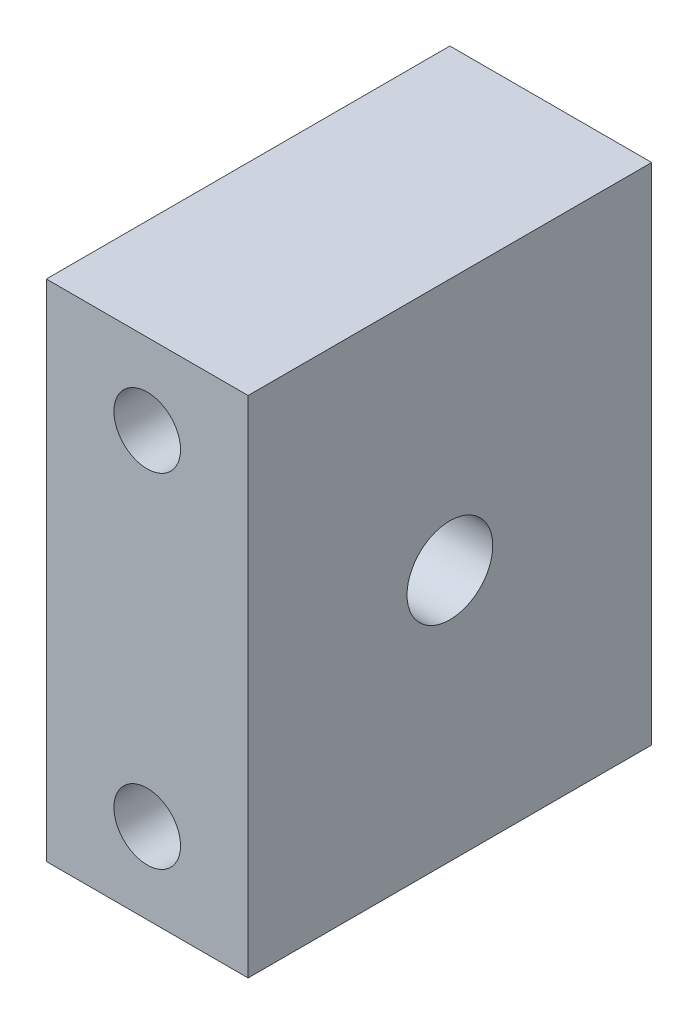
ISO-10303-21;
HEADER;
FILE_DESCRIPTION(('STEP AP214'),'2;1');
FILE_NAME('part.step','',(''),(''),'','','');
FILE_SCHEMA(('AUTOMOTIVE_DESIGN { 1 0 10303 214 1 1 1 1 }'));
ENDSEC;
DATA;
#1=APPLICATION_CONTEXT('core data for automotive mechanical design processes');
#2=APPLICATION_PROTOCOL_DEFINITION('international standard','automotive_design',2000,#1);
#3=PRODUCT_CONTEXT('',#1,'mechanical');
#4=PRODUCT('Part','Part','',(#3));
#5=PRODUCT_RELATED_PRODUCT_CATEGORY('part','',(#4));
#6=PRODUCT_DEFINITION_FORMATION('','',#4);
#7=PRODUCT_DEFINITION_CONTEXT('part definition',#1,'design');
#8=PRODUCT_DEFINITION('design','',#6,#7);
#9=PRODUCT_DEFINITION_SHAPE('','',#8);
#10=(LENGTH_UNIT() NAMED_UNIT(*) SI_UNIT(.MILLI.,.METRE.));
#11=(NAMED_UNIT(*) PLANE_ANGLE_UNIT() SI_UNIT($,.RADIAN.));
#12=(NAMED_UNIT(*) SI_UNIT($,.STERADIAN.) SOLID_ANGLE_UNIT());
#13=UNCERTAINTY_MEASURE_WITH_UNIT(LENGTH_MEASURE(1.E-05),#10,'distance_accuracy_value','');
#14=(GEOMETRIC_REPRESENTATION_CONTEXT(3) GLOBAL_UNCERTAINTY_ASSIGNED_CONTEXT((#13)) GLOBAL_UNIT_ASSIGNED_CONTEXT((#10,
#11,#12)) REPRESENTATION_CONTEXT('',''));
#15=CARTESIAN_POINT('',(0.,0.,0.));
#16=DIRECTION('',(0.,0.,1.));
#17=DIRECTION('',(1.,0.,0.));
#18=AXIS2_PLACEMENT_3D('',#15,#16,#17);
#19=CARTESIAN_POINT('',(0.,0.,40.));
#20=DIRECTION('',(0.,0.,-1.));
#21=DIRECTION('',(-1.,0.,0.));
#22=AXIS2_PLACEMENT_3D('',#19,#20,#21);
#23=PLANE('',#22);
#24=DIRECTION('',(0.,-1.,0.));
#25=VECTOR('',#24,1.);
#26=CARTESIAN_POINT('',(0.,0.,40.));
#27=LINE('',#26,#25);
#28=CARTESIAN_POINT('',(0.,50.,40.));
#29=VERTEX_POINT('',#28);
#30=CARTESIAN_POINT('',(0.,0.,40.));
#31=VERTEX_POINT('',#30);
#32=EDGE_CURVE('E98',#29,#31,#27,.T.);
#33=ORIENTED_EDGE('',*,*,#32,.T.);
#34=DIRECTION('',(1.,0.,0.));
#35=VECTOR('',#34,1.);
#36=CARTESIAN_POINT('',(0.,0.,40.));
#37=LINE('',#36,#35);
#38=CARTESIAN_POINT('',(20.,0.,40.));
#39=VERTEX_POINT('',#38);
#40=EDGE_CURVE('E93',#31,#39,#37,.T.);
#41=ORIENTED_EDGE('',*,*,#40,.T.);
#42=DIRECTION('',(0.,1.,0.));
#43=VECTOR('',#42,1.);
#44=CARTESIAN_POINT('',(20.,0.,40.));
#45=LINE('',#44,#43);
#46=CARTESIAN_POINT('',(20.,50.,40.));
#47=VERTEX_POINT('',#46);
#48=EDGE_CURVE('E96',#39,#47,#45,.T.);
#49=ORIENTED_EDGE('',*,*,#48,.T.);
#50=DIRECTION('',(-1.,0.,0.));
#51=VECTOR('',#50,1.);
#52=CARTESIAN_POINT('',(0.,50.,40.));
#53=LINE('',#52,#51);
#54=EDGE_CURVE('E63',#47,#29,#53,.T.);
#55=ORIENTED_EDGE('',*,*,#54,.T.);
#56=EDGE_LOOP('',(#33,#41,#49,#55));
#57=FACE_BOUND('',#56,.T.);
#58=CARTESIAN_POINT('',(10.,8.,40.));
#59=DIRECTION('',(0.,0.,1.));
#60=DIRECTION('',(1.,0.,0.));
#61=AXIS2_PLACEMENT_3D('',#58,#59,#60);
#62=CIRCLE('',#61,3.3);
#63=CARTESIAN_POINT('',(13.3,8.,40.));
#64=VERTEX_POINT('',#63);
#65=EDGE_CURVE('E119',#64,#64,#62,.T.);
#66=ORIENTED_EDGE('',*,*,#65,.F.);
#67=EDGE_LOOP('',(#66));
#68=FACE_BOUND('',#67,.T.);
#69=CARTESIAN_POINT('',(10.,42.,40.));
#70=DIRECTION('',(0.,0.,1.));
#71=DIRECTION('',(1.,0.,0.));
#72=AXIS2_PLACEMENT_3D('',#69,#70,#71);
#73=CIRCLE('',#72,3.3);
#74=CARTESIAN_POINT('',(13.3,42.,40.));
#75=VERTEX_POINT('',#74);
#76=EDGE_CURVE('E142',#75,#75,#73,.T.);
#77=ORIENTED_EDGE('',*,*,#76,.F.);
#78=EDGE_LOOP('',(#77));
#79=FACE_BOUND('',#78,.T.);
#80=ADVANCED_FACE('F45',(#57,#68,#79),#23,.F.);
#81=CARTESIAN_POINT('',(0.,0.,0.));
#82=DIRECTION('',(0.,0.,-1.));
#83=DIRECTION('',(-1.,0.,0.));
#84=AXIS2_PLACEMENT_3D('',#81,#82,#83);
#85=PLANE('',#84);
#86=CARTESIAN_POINT('',(10.,8.,0.));
#87=DIRECTION('',(0.,0.,1.));
#88=DIRECTION('',(1.,0.,0.));
#89=AXIS2_PLACEMENT_3D('',#86,#87,#88);
#90=CIRCLE('',#89,3.3);
#91=CARTESIAN_POINT('',(13.3,8.,0.));
#92=VERTEX_POINT('',#91);
#93=EDGE_CURVE('E138',#92,#92,#90,.T.);
#94=ORIENTED_EDGE('',*,*,#93,.T.);
#95=EDGE_LOOP('',(#94));
#96=FACE_BOUND('',#95,.T.);
#97=DIRECTION('',(0.,-1.,0.));
#98=VECTOR('',#97,1.);
#99=CARTESIAN_POINT('',(0.,0.,0.));
#100=LINE('',#99,#98);
#101=CARTESIAN_POINT('',(0.,50.,0.));
#102=VERTEX_POINT('',#101);
#103=CARTESIAN_POINT('',(0.,0.,0.));
#104=VERTEX_POINT('',#103);
#105=EDGE_CURVE('E115',#102,#104,#100,.T.);
#106=ORIENTED_EDGE('',*,*,#105,.F.);
#107=DIRECTION('',(-1.,0.,0.));
#108=VECTOR('',#107,1.);
#109=CARTESIAN_POINT('',(0.,50.,0.));
#110=LINE('',#109,#108);
#111=CARTESIAN_POINT('',(20.,50.,0.));
#112=VERTEX_POINT('',#111);
#113=EDGE_CURVE('E86',#112,#102,#110,.T.);
#114=ORIENTED_EDGE('',*,*,#113,.F.);
#115=DIRECTION('',(0.,1.,0.));
#116=VECTOR('',#115,1.);
#117=CARTESIAN_POINT('',(20.,0.,0.));
#118=LINE('',#117,#116);
#119=CARTESIAN_POINT('',(20.,0.,0.));
#120=VERTEX_POINT('',#119);
#121=EDGE_CURVE('E80',#120,#112,#118,.T.);
#122=ORIENTED_EDGE('',*,*,#121,.F.);
#123=DIRECTION('',(1.,0.,0.));
#124=VECTOR('',#123,1.);
#125=CARTESIAN_POINT('',(0.,0.,0.));
#126=LINE('',#125,#124);
#127=EDGE_CURVE('E103',#104,#120,#126,.T.);
#128=ORIENTED_EDGE('',*,*,#127,.F.);
#129=EDGE_LOOP('',(#106,#114,#122,#128));
#130=FACE_BOUND('',#129,.T.);
#131=CARTESIAN_POINT('',(10.,42.,0.));
#132=DIRECTION('',(0.,0.,1.));
#133=DIRECTION('',(1.,0.,0.));
#134=AXIS2_PLACEMENT_3D('',#131,#132,#133);
#135=CIRCLE('',#134,3.3);
#136=CARTESIAN_POINT('',(13.3,42.,0.));
#137=VERTEX_POINT('',#136);
#138=EDGE_CURVE('E146',#137,#137,#135,.T.);
#139=ORIENTED_EDGE('',*,*,#138,.T.);
#140=EDGE_LOOP('',(#139));
#141=FACE_BOUND('',#140,.T.);
#142=ADVANCED_FACE('F134',(#96,#130,#141),#85,.T.);
#143=CARTESIAN_POINT('',(0.,0.,40.));
#144=DIRECTION('',(1.,0.,0.));
#145=DIRECTION('',(0.,0.,-1.));
#146=AXIS2_PLACEMENT_3D('',#143,#144,#145);
#147=PLANE('',#146);
#148=CARTESIAN_POINT('',(0.,25.,20.));
#149=DIRECTION('',(-1.,0.,0.));
#150=DIRECTION('',(0.,0.,1.));
#151=AXIS2_PLACEMENT_3D('',#148,#149,#150);
#152=CIRCLE('',#151,4.25);
#153=CARTESIAN_POINT('',(0.,25.,24.25));
#154=VERTEX_POINT('',#153);
#155=EDGE_CURVE('E153',#154,#154,#152,.T.);
#156=ORIENTED_EDGE('',*,*,#155,.F.);
#157=EDGE_LOOP('',(#156));
#158=FACE_BOUND('',#157,.T.);
#159=ORIENTED_EDGE('',*,*,#105,.T.);
#160=DIRECTION('',(0.,0.,-1.));
#161=VECTOR('',#160,1.);
#162=CARTESIAN_POINT('',(0.,0.,40.));
#163=LINE('',#162,#161);
#164=EDGE_CURVE('E11',#31,#104,#163,.T.);
#165=ORIENTED_EDGE('',*,*,#164,.F.);
#166=ORIENTED_EDGE('',*,*,#32,.F.);
#167=DIRECTION('',(0.,0.,-1.));
#168=VECTOR('',#167,1.);
#169=CARTESIAN_POINT('',(0.,50.,40.));
#170=LINE('',#169,#168);
#171=EDGE_CURVE('E111',#29,#102,#170,.T.);
#172=ORIENTED_EDGE('',*,*,#171,.T.);
#173=EDGE_LOOP('',(#159,#165,#166,#172));
#174=FACE_BOUND('',#173,.T.);
#175=ADVANCED_FACE('F47',(#158,#174),#147,.F.);
#176=CARTESIAN_POINT('',(0.,0.,40.));
#177=DIRECTION('',(0.,1.,0.));
#178=DIRECTION('',(0.,0.,1.));
#179=AXIS2_PLACEMENT_3D('',#176,#177,#178);
#180=PLANE('',#179);
#181=ORIENTED_EDGE('',*,*,#127,.T.);
#182=DIRECTION('',(0.,0.,-1.));
#183=VECTOR('',#182,1.);
#184=CARTESIAN_POINT('',(20.,0.,40.));
#185=LINE('',#184,#183);
#186=EDGE_CURVE('E55',#39,#120,#185,.T.);
#187=ORIENTED_EDGE('',*,*,#186,.F.);
#188=ORIENTED_EDGE('',*,*,#40,.F.);
#189=ORIENTED_EDGE('',*,*,#164,.T.);
#190=EDGE_LOOP('',(#181,#187,#188,#189));
#191=FACE_BOUND('',#190,.T.);
#192=ADVANCED_FACE('F102',(#191),#180,.F.);
#193=CARTESIAN_POINT('',(20.,0.,40.));
#194=DIRECTION('',(-1.,0.,0.));
#195=DIRECTION('',(0.,0.,1.));
#196=AXIS2_PLACEMENT_3D('',#193,#194,#195);
#197=PLANE('',#196);
#198=CARTESIAN_POINT('',(20.,25.,20.));
#199=DIRECTION('',(-1.,0.,0.));
#200=DIRECTION('',(0.,0.,1.));
#201=AXIS2_PLACEMENT_3D('',#198,#199,#200);
#202=CIRCLE('',#201,4.25);
#203=CARTESIAN_POINT('',(20.,25.,24.25));
#204=VERTEX_POINT('',#203);
#205=EDGE_CURVE('E150',#204,#204,#202,.T.);
#206=ORIENTED_EDGE('',*,*,#205,.T.);
#207=EDGE_LOOP('',(#206));
#208=FACE_BOUND('',#207,.T.);
#209=ORIENTED_EDGE('',*,*,#121,.T.);
#210=DIRECTION('',(0.,0.,-1.));
#211=VECTOR('',#210,1.);
#212=CARTESIAN_POINT('',(20.,50.,40.));
#213=LINE('',#212,#211);
#214=EDGE_CURVE('E105',#47,#112,#213,.T.);
#215=ORIENTED_EDGE('',*,*,#214,.F.);
#216=ORIENTED_EDGE('',*,*,#48,.F.);
#217=ORIENTED_EDGE('',*,*,#186,.T.);
#218=EDGE_LOOP('',(#209,#215,#216,#217));
#219=FACE_BOUND('',#218,.T.);
#220=ADVANCED_FACE('F106',(#208,#219),#197,.F.);
#221=CARTESIAN_POINT('',(0.,50.,40.));
#222=DIRECTION('',(0.,-1.,0.));
#223=DIRECTION('',(0.,0.,-1.));
#224=AXIS2_PLACEMENT_3D('',#221,#222,#223);
#225=PLANE('',#224);
#226=ORIENTED_EDGE('',*,*,#113,.T.);
#227=ORIENTED_EDGE('',*,*,#171,.F.);
#228=ORIENTED_EDGE('',*,*,#54,.F.);
#229=ORIENTED_EDGE('',*,*,#214,.T.);
#230=EDGE_LOOP('',(#226,#227,#228,#229));
#231=FACE_BOUND('',#230,.T.);
#232=ADVANCED_FACE('F131',(#231),#225,.F.);
#233=CARTESIAN_POINT('',(10.,8.,40.));
#234=DIRECTION('',(0.,0.,-1.));
#235=DIRECTION('',(-1.,0.,0.));
#236=AXIS2_PLACEMENT_3D('',#233,#234,#235);
#237=CYLINDRICAL_SURFACE('',#236,3.3);
#238=ORIENTED_EDGE('',*,*,#65,.T.);
#239=EDGE_LOOP('',(#238));
#240=FACE_BOUND('',#239,.T.);
#241=ORIENTED_EDGE('',*,*,#93,.F.);
#242=EDGE_LOOP('',(#241));
#243=FACE_BOUND('',#242,.T.);
#244=ADVANCED_FACE('F178',(#240,#243),#237,.F.);
#245=CARTESIAN_POINT('',(10.,42.,40.));
#246=DIRECTION('',(0.,0.,-1.));
#247=DIRECTION('',(-1.,0.,0.));
#248=AXIS2_PLACEMENT_3D('',#245,#246,#247);
#249=CYLINDRICAL_SURFACE('',#248,3.3);
#250=ORIENTED_EDGE('',*,*,#76,.T.);
#251=EDGE_LOOP('',(#250));
#252=FACE_BOUND('',#251,.T.);
#253=ORIENTED_EDGE('',*,*,#138,.F.);
#254=EDGE_LOOP('',(#253));
#255=FACE_BOUND('',#254,.T.);
#256=ADVANCED_FACE('F164',(#252,#255),#249,.F.);
#257=CARTESIAN_POINT('',(20.,25.,20.));
#258=DIRECTION('',(-1.,0.,0.));
#259=DIRECTION('',(0.,0.,1.));
#260=AXIS2_PLACEMENT_3D('',#257,#258,#259);
#261=CYLINDRICAL_SURFACE('',#260,4.25);
#262=ORIENTED_EDGE('',*,*,#205,.F.);
#263=EDGE_LOOP('',(#262));
#264=FACE_BOUND('',#263,.T.);
#265=ORIENTED_EDGE('',*,*,#155,.T.);
#266=EDGE_LOOP('',(#265));
#267=FACE_BOUND('',#266,.T.);
#268=ADVANCED_FACE('F161',(#264,#267),#261,.F.);
#269=CLOSED_SHELL('',(#80,#142,#175,#192,#220,#232,#244,#256,#268));
#270=MANIFOLD_SOLID_BREP('B2',#269);
#271=ADVANCED_BREP_SHAPE_REPRESENTATION('',(#18,#270),#14);
#272=SHAPE_DEFINITION_REPRESENTATION(#9,#271);
ENDSEC;
END-ISO-10303-21;
